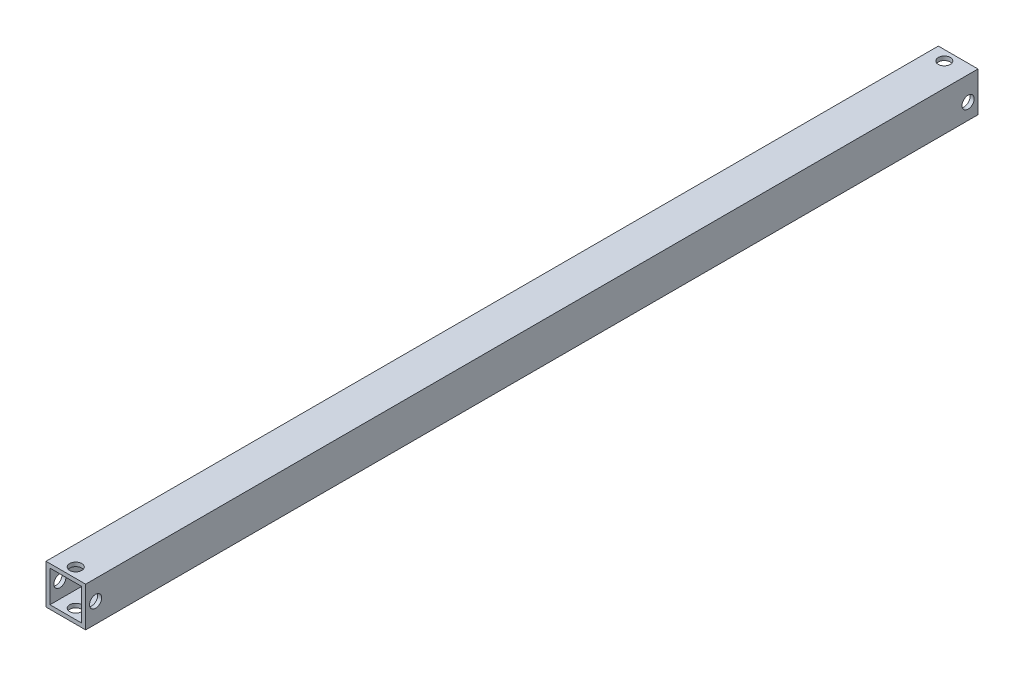
ISO-10303-21;
HEADER;
FILE_DESCRIPTION(('STEP AP214'),'2;1');
FILE_NAME('part.step','',(''),(''),'','','');
FILE_SCHEMA(('AUTOMOTIVE_DESIGN { 1 0 10303 214 1 1 1 1 }'));
ENDSEC;
DATA;
#1=APPLICATION_CONTEXT('core data for automotive mechanical design processes');
#2=APPLICATION_PROTOCOL_DEFINITION('international standard','automotive_design',2000,#1);
#3=PRODUCT_CONTEXT('',#1,'mechanical');
#4=PRODUCT('Part','Part','',(#3));
#5=PRODUCT_RELATED_PRODUCT_CATEGORY('part','',(#4));
#6=PRODUCT_DEFINITION_FORMATION('','',#4);
#7=PRODUCT_DEFINITION_CONTEXT('part definition',#1,'design');
#8=PRODUCT_DEFINITION('design','',#6,#7);
#9=PRODUCT_DEFINITION_SHAPE('','',#8);
#10=(LENGTH_UNIT() NAMED_UNIT(*) SI_UNIT(.MILLI.,.METRE.));
#11=(NAMED_UNIT(*) PLANE_ANGLE_UNIT() SI_UNIT($,.RADIAN.));
#12=(NAMED_UNIT(*) SI_UNIT($,.STERADIAN.) SOLID_ANGLE_UNIT());
#13=UNCERTAINTY_MEASURE_WITH_UNIT(LENGTH_MEASURE(1.E-05),#10,'distance_accuracy_value','');
#14=(GEOMETRIC_REPRESENTATION_CONTEXT(3) GLOBAL_UNCERTAINTY_ASSIGNED_CONTEXT((#13)) GLOBAL_UNIT_ASSIGNED_CONTEXT((#10,
#11,#12)) REPRESENTATION_CONTEXT('',''));
#15=CARTESIAN_POINT('',(0.,0.,0.));
#16=DIRECTION('',(0.,0.,1.));
#17=DIRECTION('',(1.,0.,0.));
#18=AXIS2_PLACEMENT_3D('',#15,#16,#17);
#19=CARTESIAN_POINT('',(-16.,-16.,900.));
#20=DIRECTION('',(1.,0.,0.));
#21=DIRECTION('',(0.,0.,-1.));
#22=AXIS2_PLACEMENT_3D('',#19,#20,#21);
#23=PLANE('',#22);
#24=CARTESIAN_POINT('',(-16.,0.,890.));
#25=DIRECTION('',(1.,0.,0.));
#26=DIRECTION('',(0.,0.,-1.));
#27=AXIS2_PLACEMENT_3D('',#24,#25,#26);
#28=CIRCLE('',#27,6.10000000000004);
#29=CARTESIAN_POINT('',(-16.,0.,883.9));
#30=VERTEX_POINT('',#29);
#31=EDGE_CURVE('E207',#30,#30,#28,.T.);
#32=ORIENTED_EDGE('',*,*,#31,.F.);
#33=EDGE_LOOP('',(#32));
#34=FACE_BOUND('',#33,.T.);
#35=DIRECTION('',(0.,0.,-1.));
#36=VECTOR('',#35,1.);
#37=CARTESIAN_POINT('',(-16.,-16.,900.));
#38=LINE('',#37,#36);
#39=CARTESIAN_POINT('',(-16.,-16.,900.));
#40=VERTEX_POINT('',#39);
#41=CARTESIAN_POINT('',(-16.,-16.,20.));
#42=VERTEX_POINT('',#41);
#43=EDGE_CURVE('E155',#40,#42,#38,.T.);
#44=ORIENTED_EDGE('',*,*,#43,.T.);
#45=DIRECTION('',(0.,-1.,0.));
#46=VECTOR('',#45,1.);
#47=CARTESIAN_POINT('',(-16.,-16.,20.));
#48=LINE('',#47,#46);
#49=CARTESIAN_POINT('',(-16.,16.,20.));
#50=VERTEX_POINT('',#49);
#51=EDGE_CURVE('E144',#50,#42,#48,.T.);
#52=ORIENTED_EDGE('',*,*,#51,.F.);
#53=DIRECTION('',(0.,0.,-1.));
#54=VECTOR('',#53,1.);
#55=CARTESIAN_POINT('',(-16.,16.,900.));
#56=LINE('',#55,#54);
#57=CARTESIAN_POINT('',(-16.,16.,900.));
#58=VERTEX_POINT('',#57);
#59=EDGE_CURVE('E161',#58,#50,#56,.T.);
#60=ORIENTED_EDGE('',*,*,#59,.F.);
#61=DIRECTION('',(0.,-1.,0.));
#62=VECTOR('',#61,1.);
#63=CARTESIAN_POINT('',(-16.,-16.,900.));
#64=LINE('',#63,#62);
#65=EDGE_CURVE('E253',#58,#40,#64,.T.);
#66=ORIENTED_EDGE('',*,*,#65,.T.);
#67=EDGE_LOOP('',(#44,#52,#60,#66));
#68=FACE_BOUND('',#67,.T.);
#69=ADVANCED_FACE('F38',(#34,#68),#23,.T.);
#70=CARTESIAN_POINT('',(16.,-16.,900.));
#71=DIRECTION('',(0.,1.,0.));
#72=DIRECTION('',(-1.,0.,0.));
#73=AXIS2_PLACEMENT_3D('',#70,#71,#72);
#74=PLANE('',#73);
#75=CARTESIAN_POINT('',(0.,-16.,890.));
#76=DIRECTION('',(0.,1.,0.));
#77=DIRECTION('',(-1.,0.,0.));
#78=AXIS2_PLACEMENT_3D('',#75,#76,#77);
#79=CIRCLE('',#78,6.10000000000001);
#80=CARTESIAN_POINT('',(-6.10000000000001,-16.,890.));
#81=VERTEX_POINT('',#80);
#82=EDGE_CURVE('E204',#81,#81,#79,.T.);
#83=ORIENTED_EDGE('',*,*,#82,.F.);
#84=EDGE_LOOP('',(#83));
#85=FACE_BOUND('',#84,.T.);
#86=DIRECTION('',(0.,0.,-1.));
#87=VECTOR('',#86,1.);
#88=CARTESIAN_POINT('',(16.,-16.,900.));
#89=LINE('',#88,#87);
#90=CARTESIAN_POINT('',(16.,-16.,900.));
#91=VERTEX_POINT('',#90);
#92=CARTESIAN_POINT('',(16.,-16.,20.));
#93=VERTEX_POINT('',#92);
#94=EDGE_CURVE('E131',#91,#93,#89,.T.);
#95=ORIENTED_EDGE('',*,*,#94,.T.);
#96=DIRECTION('',(1.,0.,0.));
#97=VECTOR('',#96,1.);
#98=CARTESIAN_POINT('',(16.,-16.,20.));
#99=LINE('',#98,#97);
#100=EDGE_CURVE('E139',#42,#93,#99,.T.);
#101=ORIENTED_EDGE('',*,*,#100,.F.);
#102=ORIENTED_EDGE('',*,*,#43,.F.);
#103=DIRECTION('',(1.,0.,0.));
#104=VECTOR('',#103,1.);
#105=CARTESIAN_POINT('',(16.,-16.,900.));
#106=LINE('',#105,#104);
#107=EDGE_CURVE('E153',#40,#91,#106,.T.);
#108=ORIENTED_EDGE('',*,*,#107,.T.);
#109=EDGE_LOOP('',(#95,#101,#102,#108));
#110=FACE_BOUND('',#109,.T.);
#111=ADVANCED_FACE('F151',(#85,#110),#74,.T.);
#112=CARTESIAN_POINT('',(0.,0.,900.));
#113=DIRECTION('',(0.,0.,1.));
#114=DIRECTION('',(1.,0.,0.));
#115=AXIS2_PLACEMENT_3D('',#112,#113,#114);
#116=PLANE('',#115);
#117=DIRECTION('',(0.,-1.,0.));
#118=VECTOR('',#117,1.);
#119=CARTESIAN_POINT('',(-20.,-20.,900.));
#120=LINE('',#119,#118);
#121=CARTESIAN_POINT('',(-20.,20.,900.));
#122=VERTEX_POINT('',#121);
#123=CARTESIAN_POINT('',(-20.,-20.,900.));
#124=VERTEX_POINT('',#123);
#125=EDGE_CURVE('E165',#122,#124,#120,.T.);
#126=ORIENTED_EDGE('',*,*,#125,.T.);
#127=DIRECTION('',(1.,0.,0.));
#128=VECTOR('',#127,1.);
#129=CARTESIAN_POINT('',(20.,-20.,900.));
#130=LINE('',#129,#128);
#131=CARTESIAN_POINT('',(20.,-20.,900.));
#132=VERTEX_POINT('',#131);
#133=EDGE_CURVE('E90',#124,#132,#130,.T.);
#134=ORIENTED_EDGE('',*,*,#133,.T.);
#135=DIRECTION('',(0.,1.,0.));
#136=VECTOR('',#135,1.);
#137=CARTESIAN_POINT('',(20.,-20.,900.));
#138=LINE('',#137,#136);
#139=CARTESIAN_POINT('',(20.,20.,900.));
#140=VERTEX_POINT('',#139);
#141=EDGE_CURVE('E170',#132,#140,#138,.T.);
#142=ORIENTED_EDGE('',*,*,#141,.T.);
#143=DIRECTION('',(-1.,0.,0.));
#144=VECTOR('',#143,1.);
#145=CARTESIAN_POINT('',(20.,20.,900.));
#146=LINE('',#145,#144);
#147=EDGE_CURVE('E65',#140,#122,#146,.T.);
#148=ORIENTED_EDGE('',*,*,#147,.T.);
#149=EDGE_LOOP('',(#126,#134,#142,#148));
#150=FACE_BOUND('',#149,.T.);
#151=ORIENTED_EDGE('',*,*,#107,.F.);
#152=ORIENTED_EDGE('',*,*,#65,.F.);
#153=DIRECTION('',(-1.,0.,0.));
#154=VECTOR('',#153,1.);
#155=CARTESIAN_POINT('',(16.,16.,900.));
#156=LINE('',#155,#154);
#157=CARTESIAN_POINT('',(16.,16.,900.));
#158=VERTEX_POINT('',#157);
#159=EDGE_CURVE('E262',#158,#58,#156,.T.);
#160=ORIENTED_EDGE('',*,*,#159,.F.);
#161=DIRECTION('',(0.,1.,0.));
#162=VECTOR('',#161,1.);
#163=CARTESIAN_POINT('',(16.,-16.,900.));
#164=LINE('',#163,#162);
#165=EDGE_CURVE('E259',#91,#158,#164,.T.);
#166=ORIENTED_EDGE('',*,*,#165,.F.);
#167=EDGE_LOOP('',(#151,#152,#160,#166));
#168=FACE_BOUND('',#167,.T.);
#169=ADVANCED_FACE('F277',(#150,#168),#116,.T.);
#170=CARTESIAN_POINT('',(0.,0.,0.));
#171=DIRECTION('',(0.,0.,1.));
#172=DIRECTION('',(1.,0.,0.));
#173=AXIS2_PLACEMENT_3D('',#170,#171,#172);
#174=PLANE('',#173);
#175=DIRECTION('',(-1.,0.,0.));
#176=VECTOR('',#175,1.);
#177=CARTESIAN_POINT('',(16.,16.,0.));
#178=LINE('',#177,#176);
#179=CARTESIAN_POINT('',(16.,16.,0.));
#180=VERTEX_POINT('',#179);
#181=CARTESIAN_POINT('',(-20.,16.,0.));
#182=VERTEX_POINT('',#181);
#183=EDGE_CURVE('E256',#180,#182,#178,.T.);
#184=ORIENTED_EDGE('',*,*,#183,.T.);
#185=DIRECTION('',(0.,-1.,0.));
#186=VECTOR('',#185,1.);
#187=CARTESIAN_POINT('',(-20.,-20.,0.));
#188=LINE('',#187,#186);
#189=CARTESIAN_POINT('',(-20.,20.,0.));
#190=VERTEX_POINT('',#189);
#191=EDGE_CURVE('E159',#190,#182,#188,.T.);
#192=ORIENTED_EDGE('',*,*,#191,.F.);
#193=DIRECTION('',(-1.,0.,0.));
#194=VECTOR('',#193,1.);
#195=CARTESIAN_POINT('',(20.,20.,0.));
#196=LINE('',#195,#194);
#197=CARTESIAN_POINT('',(20.,20.,0.));
#198=VERTEX_POINT('',#197);
#199=EDGE_CURVE('E83',#198,#190,#196,.T.);
#200=ORIENTED_EDGE('',*,*,#199,.F.);
#201=DIRECTION('',(0.,1.,0.));
#202=VECTOR('',#201,1.);
#203=CARTESIAN_POINT('',(20.,-20.,0.));
#204=LINE('',#203,#202);
#205=CARTESIAN_POINT('',(20.,-20.,0.));
#206=VERTEX_POINT('',#205);
#207=EDGE_CURVE('E182',#206,#198,#204,.T.);
#208=ORIENTED_EDGE('',*,*,#207,.F.);
#209=DIRECTION('',(1.,0.,0.));
#210=VECTOR('',#209,1.);
#211=CARTESIAN_POINT('',(20.,-20.,0.));
#212=LINE('',#211,#210);
#213=CARTESIAN_POINT('',(16.,-20.,0.));
#214=VERTEX_POINT('',#213);
#215=EDGE_CURVE('E179',#214,#206,#212,.T.);
#216=ORIENTED_EDGE('',*,*,#215,.F.);
#217=DIRECTION('',(0.,1.,0.));
#218=VECTOR('',#217,1.);
#219=CARTESIAN_POINT('',(16.,-16.,0.));
#220=LINE('',#219,#218);
#221=EDGE_CURVE('E250',#214,#180,#220,.T.);
#222=ORIENTED_EDGE('',*,*,#221,.T.);
#223=EDGE_LOOP('',(#184,#192,#200,#208,#216,#222));
#224=FACE_BOUND('',#223,.T.);
#225=ADVANCED_FACE('F282',(#224),#174,.F.);
#226=CARTESIAN_POINT('',(-20.,-20.,900.));
#227=DIRECTION('',(1.,0.,0.));
#228=DIRECTION('',(0.,0.,-1.));
#229=AXIS2_PLACEMENT_3D('',#226,#227,#228);
#230=PLANE('',#229);
#231=CARTESIAN_POINT('',(-20.,0.,890.));
#232=DIRECTION('',(-1.,0.,0.));
#233=DIRECTION('',(0.,0.,1.));
#234=AXIS2_PLACEMENT_3D('',#231,#232,#233);
#235=CIRCLE('',#234,6.10000000000004);
#236=CARTESIAN_POINT('',(-20.,0.,896.1));
#237=VERTEX_POINT('',#236);
#238=EDGE_CURVE('E329',#237,#237,#235,.T.);
#239=ORIENTED_EDGE('',*,*,#238,.F.);
#240=EDGE_LOOP('',(#239));
#241=FACE_BOUND('',#240,.T.);
#242=ORIENTED_EDGE('',*,*,#191,.T.);
#243=DIRECTION('',(0.,0.,-1.));
#244=VECTOR('',#243,1.);
#245=CARTESIAN_POINT('',(-20.,16.,20.));
#246=LINE('',#245,#244);
#247=CARTESIAN_POINT('',(-20.,16.,20.));
#248=VERTEX_POINT('',#247);
#249=EDGE_CURVE('E246',#248,#182,#246,.T.);
#250=ORIENTED_EDGE('',*,*,#249,.F.);
#251=DIRECTION('',(0.,1.,0.));
#252=VECTOR('',#251,1.);
#253=CARTESIAN_POINT('',(-20.,16.,20.));
#254=LINE('',#253,#252);
#255=CARTESIAN_POINT('',(-20.,-20.,20.));
#256=VERTEX_POINT('',#255);
#257=EDGE_CURVE('E237',#256,#248,#254,.T.);
#258=ORIENTED_EDGE('',*,*,#257,.F.);
#259=DIRECTION('',(0.,0.,-1.));
#260=VECTOR('',#259,1.);
#261=CARTESIAN_POINT('',(-20.,-20.,900.));
#262=LINE('',#261,#260);
#263=EDGE_CURVE('E11',#124,#256,#262,.T.);
#264=ORIENTED_EDGE('',*,*,#263,.F.);
#265=ORIENTED_EDGE('',*,*,#125,.F.);
#266=DIRECTION('',(0.,0.,-1.));
#267=VECTOR('',#266,1.);
#268=CARTESIAN_POINT('',(-20.,20.,900.));
#269=LINE('',#268,#267);
#270=EDGE_CURVE('E175',#122,#190,#269,.T.);
#271=ORIENTED_EDGE('',*,*,#270,.T.);
#272=EDGE_LOOP('',(#242,#250,#258,#264,#265,#271));
#273=FACE_BOUND('',#272,.T.);
#274=ADVANCED_FACE('F40',(#241,#273),#230,.F.);
#275=CARTESIAN_POINT('',(20.,-20.,900.));
#276=DIRECTION('',(0.,1.,0.));
#277=DIRECTION('',(0.,0.,1.));
#278=AXIS2_PLACEMENT_3D('',#275,#276,#277);
#279=PLANE('',#278);
#280=CARTESIAN_POINT('',(0.,-20.,890.));
#281=DIRECTION('',(0.,-1.,0.));
#282=DIRECTION('',(0.,0.,-1.));
#283=AXIS2_PLACEMENT_3D('',#280,#281,#282);
#284=CIRCLE('',#283,6.10000000000001);
#285=CARTESIAN_POINT('',(0.,-20.,883.9));
#286=VERTEX_POINT('',#285);
#287=EDGE_CURVE('E198',#286,#286,#284,.T.);
#288=ORIENTED_EDGE('',*,*,#287,.F.);
#289=EDGE_LOOP('',(#288));
#290=FACE_BOUND('',#289,.T.);
#291=DIRECTION('',(-1.,0.,0.));
#292=VECTOR('',#291,1.);
#293=CARTESIAN_POINT('',(16.,-20.,20.));
#294=LINE('',#293,#292);
#295=CARTESIAN_POINT('',(16.,-20.,20.));
#296=VERTEX_POINT('',#295);
#297=EDGE_CURVE('E138',#296,#256,#294,.T.);
#298=ORIENTED_EDGE('',*,*,#297,.F.);
#299=DIRECTION('',(0.,0.,-1.));
#300=VECTOR('',#299,1.);
#301=CARTESIAN_POINT('',(16.,-20.,20.));
#302=LINE('',#301,#300);
#303=EDGE_CURVE('E134',#296,#214,#302,.T.);
#304=ORIENTED_EDGE('',*,*,#303,.T.);
#305=ORIENTED_EDGE('',*,*,#215,.T.);
#306=DIRECTION('',(0.,0.,-1.));
#307=VECTOR('',#306,1.);
#308=CARTESIAN_POINT('',(20.,-20.,900.));
#309=LINE('',#308,#307);
#310=EDGE_CURVE('E48',#132,#206,#309,.T.);
#311=ORIENTED_EDGE('',*,*,#310,.F.);
#312=ORIENTED_EDGE('',*,*,#133,.F.);
#313=ORIENTED_EDGE('',*,*,#263,.T.);
#314=EDGE_LOOP('',(#298,#304,#305,#311,#312,#313));
#315=FACE_BOUND('',#314,.T.);
#316=ADVANCED_FACE('F284',(#290,#315),#279,.F.);
#317=CARTESIAN_POINT('',(20.,-20.,900.));
#318=DIRECTION('',(-1.,0.,0.));
#319=DIRECTION('',(0.,0.,1.));
#320=AXIS2_PLACEMENT_3D('',#317,#318,#319);
#321=PLANE('',#320);
#322=CARTESIAN_POINT('',(20.,0.,890.));
#323=DIRECTION('',(-1.,0.,0.));
#324=DIRECTION('',(0.,0.,1.));
#325=AXIS2_PLACEMENT_3D('',#322,#323,#324);
#326=CIRCLE('',#325,6.10000000000004);
#327=CARTESIAN_POINT('',(20.,0.,896.1));
#328=VERTEX_POINT('',#327);
#329=EDGE_CURVE('E213',#328,#328,#326,.T.);
#330=ORIENTED_EDGE('',*,*,#329,.T.);
#331=EDGE_LOOP('',(#330));
#332=FACE_BOUND('',#331,.T.);
#333=CARTESIAN_POINT('',(20.,-4.,10.));
#334=DIRECTION('',(-1.,0.,0.));
#335=DIRECTION('',(0.,0.,1.));
#336=AXIS2_PLACEMENT_3D('',#333,#334,#335);
#337=CIRCLE('',#336,6.1);
#338=CARTESIAN_POINT('',(20.,-4.,16.1));
#339=VERTEX_POINT('',#338);
#340=EDGE_CURVE('E149',#339,#339,#337,.T.);
#341=ORIENTED_EDGE('',*,*,#340,.T.);
#342=EDGE_LOOP('',(#341));
#343=FACE_BOUND('',#342,.T.);
#344=ORIENTED_EDGE('',*,*,#207,.T.);
#345=DIRECTION('',(0.,0.,-1.));
#346=VECTOR('',#345,1.);
#347=CARTESIAN_POINT('',(20.,20.,900.));
#348=LINE('',#347,#346);
#349=EDGE_CURVE('E189',#140,#198,#348,.T.);
#350=ORIENTED_EDGE('',*,*,#349,.F.);
#351=ORIENTED_EDGE('',*,*,#141,.F.);
#352=ORIENTED_EDGE('',*,*,#310,.T.);
#353=EDGE_LOOP('',(#344,#350,#351,#352));
#354=FACE_BOUND('',#353,.T.);
#355=ADVANCED_FACE('F287',(#332,#343,#354),#321,.F.);
#356=CARTESIAN_POINT('',(20.,20.,900.));
#357=DIRECTION('',(0.,-1.,0.));
#358=DIRECTION('',(0.,0.,-1.));
#359=AXIS2_PLACEMENT_3D('',#356,#357,#358);
#360=PLANE('',#359);
#361=CARTESIAN_POINT('',(0.,20.,890.));
#362=DIRECTION('',(0.,-1.,0.));
#363=DIRECTION('',(0.,0.,-1.));
#364=AXIS2_PLACEMENT_3D('',#361,#362,#363);
#365=CIRCLE('',#364,6.10000000000001);
#366=CARTESIAN_POINT('',(0.,20.,883.9));
#367=VERTEX_POINT('',#366);
#368=EDGE_CURVE('E197',#367,#367,#365,.T.);
#369=ORIENTED_EDGE('',*,*,#368,.T.);
#370=EDGE_LOOP('',(#369));
#371=FACE_BOUND('',#370,.T.);
#372=CARTESIAN_POINT('',(-4.,20.,10.));
#373=DIRECTION('',(0.,-1.,0.));
#374=DIRECTION('',(0.,0.,-1.));
#375=AXIS2_PLACEMENT_3D('',#372,#373,#374);
#376=CIRCLE('',#375,6.1);
#377=CARTESIAN_POINT('',(-4.,20.,3.9));
#378=VERTEX_POINT('',#377);
#379=EDGE_CURVE('E224',#378,#378,#376,.T.);
#380=ORIENTED_EDGE('',*,*,#379,.T.);
#381=EDGE_LOOP('',(#380));
#382=FACE_BOUND('',#381,.T.);
#383=ORIENTED_EDGE('',*,*,#199,.T.);
#384=ORIENTED_EDGE('',*,*,#270,.F.);
#385=ORIENTED_EDGE('',*,*,#147,.F.);
#386=ORIENTED_EDGE('',*,*,#349,.T.);
#387=EDGE_LOOP('',(#383,#384,#385,#386));
#388=FACE_BOUND('',#387,.T.);
#389=ADVANCED_FACE('F293',(#371,#382,#388),#360,.F.);
#390=CARTESIAN_POINT('',(16.,-16.,900.));
#391=DIRECTION('',(-1.,0.,0.));
#392=DIRECTION('',(0.,-1.,0.));
#393=AXIS2_PLACEMENT_3D('',#390,#391,#392);
#394=PLANE('',#393);
#395=CARTESIAN_POINT('',(16.,0.,890.));
#396=DIRECTION('',(-1.,0.,0.));
#397=DIRECTION('',(0.,-1.,0.));
#398=AXIS2_PLACEMENT_3D('',#395,#396,#397);
#399=CIRCLE('',#398,6.10000000000004);
#400=CARTESIAN_POINT('',(16.,-6.10000000000003,890.));
#401=VERTEX_POINT('',#400);
#402=EDGE_CURVE('E42',#401,#401,#399,.T.);
#403=ORIENTED_EDGE('',*,*,#402,.F.);
#404=EDGE_LOOP('',(#403));
#405=FACE_BOUND('',#404,.T.);
#406=CARTESIAN_POINT('',(16.,-4.,10.));
#407=DIRECTION('',(-1.,0.,0.));
#408=DIRECTION('',(0.,-1.,0.));
#409=AXIS2_PLACEMENT_3D('',#406,#407,#408);
#410=CIRCLE('',#409,6.1);
#411=CARTESIAN_POINT('',(16.,-10.1,10.));
#412=VERTEX_POINT('',#411);
#413=EDGE_CURVE('E228',#412,#412,#410,.T.);
#414=ORIENTED_EDGE('',*,*,#413,.F.);
#415=EDGE_LOOP('',(#414));
#416=FACE_BOUND('',#415,.T.);
#417=ORIENTED_EDGE('',*,*,#221,.F.);
#418=ORIENTED_EDGE('',*,*,#303,.F.);
#419=DIRECTION('',(0.,-1.,0.));
#420=VECTOR('',#419,1.);
#421=CARTESIAN_POINT('',(16.,-16.,20.));
#422=LINE('',#421,#420);
#423=EDGE_CURVE('E127',#93,#296,#422,.T.);
#424=ORIENTED_EDGE('',*,*,#423,.F.);
#425=ORIENTED_EDGE('',*,*,#94,.F.);
#426=ORIENTED_EDGE('',*,*,#165,.T.);
#427=DIRECTION('',(0.,0.,-1.));
#428=VECTOR('',#427,1.);
#429=CARTESIAN_POINT('',(16.,16.,900.));
#430=LINE('',#429,#428);
#431=EDGE_CURVE('E56',#158,#180,#430,.T.);
#432=ORIENTED_EDGE('',*,*,#431,.T.);
#433=EDGE_LOOP('',(#417,#418,#424,#425,#426,#432));
#434=FACE_BOUND('',#433,.T.);
#435=ADVANCED_FACE('F129',(#405,#416,#434),#394,.T.);
#436=CARTESIAN_POINT('',(16.,16.,900.));
#437=DIRECTION('',(0.,-1.,0.));
#438=DIRECTION('',(1.,0.,0.));
#439=AXIS2_PLACEMENT_3D('',#436,#437,#438);
#440=PLANE('',#439);
#441=CARTESIAN_POINT('',(0.,16.,890.));
#442=DIRECTION('',(0.,-1.,0.));
#443=DIRECTION('',(1.,0.,0.));
#444=AXIS2_PLACEMENT_3D('',#441,#442,#443);
#445=CIRCLE('',#444,6.10000000000001);
#446=CARTESIAN_POINT('',(6.10000000000001,16.,890.));
#447=VERTEX_POINT('',#446);
#448=EDGE_CURVE('E194',#447,#447,#445,.T.);
#449=ORIENTED_EDGE('',*,*,#448,.F.);
#450=EDGE_LOOP('',(#449));
#451=FACE_BOUND('',#450,.T.);
#452=CARTESIAN_POINT('',(-4.,16.,10.));
#453=DIRECTION('',(0.,-1.,0.));
#454=DIRECTION('',(1.,0.,0.));
#455=AXIS2_PLACEMENT_3D('',#452,#453,#454);
#456=CIRCLE('',#455,6.1);
#457=CARTESIAN_POINT('',(2.1,16.,10.));
#458=VERTEX_POINT('',#457);
#459=EDGE_CURVE('E220',#458,#458,#456,.T.);
#460=ORIENTED_EDGE('',*,*,#459,.F.);
#461=EDGE_LOOP('',(#460));
#462=FACE_BOUND('',#461,.T.);
#463=ORIENTED_EDGE('',*,*,#183,.F.);
#464=ORIENTED_EDGE('',*,*,#431,.F.);
#465=ORIENTED_EDGE('',*,*,#159,.T.);
#466=ORIENTED_EDGE('',*,*,#59,.T.);
#467=DIRECTION('',(1.,0.,0.));
#468=VECTOR('',#467,1.);
#469=CARTESIAN_POINT('',(-16.,16.,20.));
#470=LINE('',#469,#468);
#471=EDGE_CURVE('E241',#248,#50,#470,.T.);
#472=ORIENTED_EDGE('',*,*,#471,.F.);
#473=ORIENTED_EDGE('',*,*,#249,.T.);
#474=EDGE_LOOP('',(#463,#464,#465,#466,#472,#473));
#475=FACE_BOUND('',#474,.T.);
#476=ADVANCED_FACE('F272',(#451,#462,#475),#440,.T.);
#477=CARTESIAN_POINT('',(0.,0.,20.));
#478=DIRECTION('',(0.,0.,-1.));
#479=DIRECTION('',(-1.,0.,0.));
#480=AXIS2_PLACEMENT_3D('',#477,#478,#479);
#481=PLANE('',#480);
#482=ORIENTED_EDGE('',*,*,#100,.T.);
#483=ORIENTED_EDGE('',*,*,#423,.T.);
#484=ORIENTED_EDGE('',*,*,#297,.T.);
#485=ORIENTED_EDGE('',*,*,#257,.T.);
#486=ORIENTED_EDGE('',*,*,#471,.T.);
#487=ORIENTED_EDGE('',*,*,#51,.T.);
#488=EDGE_LOOP('',(#482,#483,#484,#485,#486,#487));
#489=FACE_BOUND('',#488,.T.);
#490=ADVANCED_FACE('F142',(#489),#481,.T.);
#491=CARTESIAN_POINT('',(36.,-3.99999999999999,10.));
#492=DIRECTION('',(-1.,0.,0.));
#493=DIRECTION('',(0.,-1.,0.));
#494=AXIS2_PLACEMENT_3D('',#491,#492,#493);
#495=CYLINDRICAL_SURFACE('',#494,6.1);
#496=ORIENTED_EDGE('',*,*,#413,.T.);
#497=EDGE_LOOP('',(#496));
#498=FACE_BOUND('',#497,.T.);
#499=ORIENTED_EDGE('',*,*,#340,.F.);
#500=EDGE_LOOP('',(#499));
#501=FACE_BOUND('',#500,.T.);
#502=ADVANCED_FACE('F359',(#498,#501),#495,.F.);
#503=CARTESIAN_POINT('',(-4.,36.,10.));
#504=DIRECTION('',(0.,-1.,0.));
#505=DIRECTION('',(1.,0.,0.));
#506=AXIS2_PLACEMENT_3D('',#503,#504,#505);
#507=CYLINDRICAL_SURFACE('',#506,6.1);
#508=ORIENTED_EDGE('',*,*,#459,.T.);
#509=EDGE_LOOP('',(#508));
#510=FACE_BOUND('',#509,.T.);
#511=ORIENTED_EDGE('',*,*,#379,.F.);
#512=EDGE_LOOP('',(#511));
#513=FACE_BOUND('',#512,.T.);
#514=ADVANCED_FACE('F356',(#510,#513),#507,.F.);
#515=CARTESIAN_POINT('',(0.,40.,890.));
#516=DIRECTION('',(0.,-1.,0.));
#517=DIRECTION('',(0.,0.,-1.));
#518=AXIS2_PLACEMENT_3D('',#515,#516,#517);
#519=CYLINDRICAL_SURFACE('',#518,6.10000000000001);
#520=ORIENTED_EDGE('',*,*,#448,.T.);
#521=EDGE_LOOP('',(#520));
#522=FACE_BOUND('',#521,.T.);
#523=ORIENTED_EDGE('',*,*,#368,.F.);
#524=EDGE_LOOP('',(#523));
#525=FACE_BOUND('',#524,.T.);
#526=ADVANCED_FACE('F351',(#522,#525),#519,.F.);
#527=ORIENTED_EDGE('',*,*,#82,.T.);
#528=EDGE_LOOP('',(#527));
#529=FACE_BOUND('',#528,.T.);
#530=ORIENTED_EDGE('',*,*,#287,.T.);
#531=EDGE_LOOP('',(#530));
#532=FACE_BOUND('',#531,.T.);
#533=ADVANCED_FACE('F343',(#529,#532),#519,.F.);
#534=CARTESIAN_POINT('',(40.,0.,890.));
#535=DIRECTION('',(-1.,0.,0.));
#536=DIRECTION('',(0.,0.,1.));
#537=AXIS2_PLACEMENT_3D('',#534,#535,#536);
#538=CYLINDRICAL_SURFACE('',#537,6.10000000000004);
#539=ORIENTED_EDGE('',*,*,#402,.T.);
#540=EDGE_LOOP('',(#539));
#541=FACE_BOUND('',#540,.T.);
#542=ORIENTED_EDGE('',*,*,#329,.F.);
#543=EDGE_LOOP('',(#542));
#544=FACE_BOUND('',#543,.T.);
#545=ADVANCED_FACE('F340',(#541,#544),#538,.F.);
#546=ORIENTED_EDGE('',*,*,#31,.T.);
#547=EDGE_LOOP('',(#546));
#548=FACE_BOUND('',#547,.T.);
#549=ORIENTED_EDGE('',*,*,#238,.T.);
#550=EDGE_LOOP('',(#549));
#551=FACE_BOUND('',#550,.T.);
#552=ADVANCED_FACE('F342',(#548,#551),#538,.F.);
#553=CLOSED_SHELL('',(#69,#111,#169,#225,#274,#316,#355,#389,#435,#476,#490,#502,#514,#526,#533,
#545,#552));
#554=MANIFOLD_SOLID_BREP('B2',#553);
#555=ADVANCED_BREP_SHAPE_REPRESENTATION('',(#18,#554),#14);
#556=SHAPE_DEFINITION_REPRESENTATION(#9,#555);
ENDSEC;
END-ISO-10303-21;
